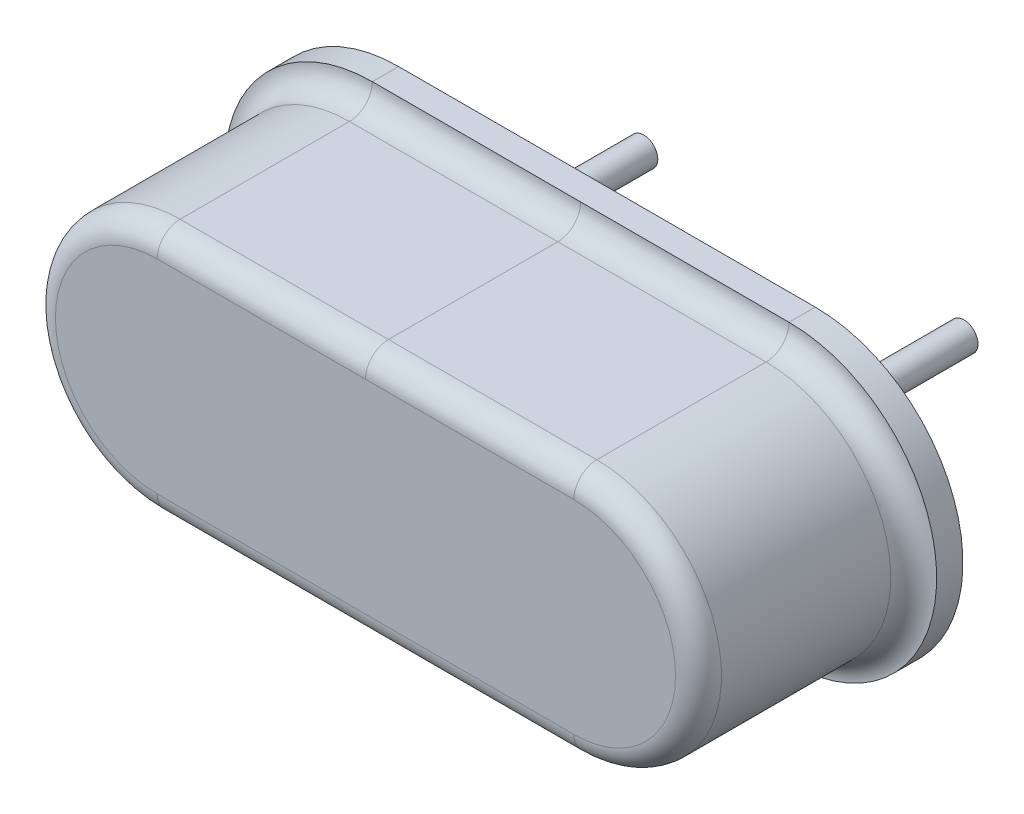
ISO-10303-21;
HEADER;
FILE_DESCRIPTION(('STEP AP214'),'2;1');
FILE_NAME('part.step','',(''),(''),'','','');
FILE_SCHEMA(('AUTOMOTIVE_DESIGN { 1 0 10303 214 1 1 1 1 }'));
ENDSEC;
DATA;
#1=APPLICATION_CONTEXT('core data for automotive mechanical design processes');
#2=APPLICATION_PROTOCOL_DEFINITION('international standard','automotive_design',2000,#1);
#3=PRODUCT_CONTEXT('',#1,'mechanical');
#4=PRODUCT('Part','Part','',(#3));
#5=PRODUCT_RELATED_PRODUCT_CATEGORY('part','',(#4));
#6=PRODUCT_DEFINITION_FORMATION('','',#4);
#7=PRODUCT_DEFINITION_CONTEXT('part definition',#1,'design');
#8=PRODUCT_DEFINITION('design','',#6,#7);
#9=PRODUCT_DEFINITION_SHAPE('','',#8);
#10=(LENGTH_UNIT() NAMED_UNIT(*) SI_UNIT(.MILLI.,.METRE.));
#11=(NAMED_UNIT(*) PLANE_ANGLE_UNIT() SI_UNIT($,.RADIAN.));
#12=(NAMED_UNIT(*) SI_UNIT($,.STERADIAN.) SOLID_ANGLE_UNIT());
#13=UNCERTAINTY_MEASURE_WITH_UNIT(LENGTH_MEASURE(1.E-05),#10,'distance_accuracy_value','');
#14=(GEOMETRIC_REPRESENTATION_CONTEXT(3) GLOBAL_UNCERTAINTY_ASSIGNED_CONTEXT((#13)) GLOBAL_UNIT_ASSIGNED_CONTEXT((#10,
#11,#12)) REPRESENTATION_CONTEXT('',''));
#15=CARTESIAN_POINT('',(0.,0.,0.));
#16=DIRECTION('',(0.,0.,1.));
#17=DIRECTION('',(1.,0.,0.));
#18=AXIS2_PLACEMENT_3D('',#15,#16,#17);
#19=CARTESIAN_POINT('',(-3.175,0.,3.68));
#20=DIRECTION('',(0.,0.,-1.));
#21=DIRECTION('',(-1.,0.,0.));
#22=AXIS2_PLACEMENT_3D('',#19,#20,#21);
#23=CYLINDRICAL_SURFACE('',#22,2.25);
#24=CARTESIAN_POINT('',(-3.175,0.,0.4));
#25=DIRECTION('',(0.,0.,1.));
#26=DIRECTION('',(0.,1.,0.));
#27=AXIS2_PLACEMENT_3D('',#24,#25,#26);
#28=CIRCLE('',#27,2.25);
#29=CARTESIAN_POINT('',(-3.175,2.25,0.4));
#30=VERTEX_POINT('',#29);
#31=CARTESIAN_POINT('',(-3.175,-2.25,0.4));
#32=VERTEX_POINT('',#31);
#33=EDGE_CURVE('E158',#30,#32,#28,.T.);
#34=ORIENTED_EDGE('',*,*,#33,.F.);
#35=DIRECTION('',(0.,0.,-1.));
#36=VECTOR('',#35,1.);
#37=CARTESIAN_POINT('',(-3.175,2.25,3.68));
#38=LINE('',#37,#36);
#39=CARTESIAN_POINT('',(-3.175,2.25,0.));
#40=VERTEX_POINT('',#39);
#41=EDGE_CURVE('E233',#30,#40,#38,.T.);
#42=ORIENTED_EDGE('',*,*,#41,.T.);
#43=CARTESIAN_POINT('',(-3.175,0.,0.));
#44=DIRECTION('',(0.,0.,1.));
#45=DIRECTION('',(1.,0.,0.));
#46=AXIS2_PLACEMENT_3D('',#43,#44,#45);
#47=CIRCLE('',#46,2.25);
#48=CARTESIAN_POINT('',(-3.175,-2.25,0.));
#49=VERTEX_POINT('',#48);
#50=EDGE_CURVE('E221',#40,#49,#47,.T.);
#51=ORIENTED_EDGE('',*,*,#50,.T.);
#52=DIRECTION('',(0.,0.,-1.));
#53=VECTOR('',#52,1.);
#54=CARTESIAN_POINT('',(-3.175,-2.25,3.68));
#55=LINE('',#54,#53);
#56=EDGE_CURVE('E239',#32,#49,#55,.T.);
#57=ORIENTED_EDGE('',*,*,#56,.F.);
#58=EDGE_LOOP('',(#34,#42,#51,#57));
#59=FACE_BOUND('',#58,.T.);
#60=ADVANCED_FACE('F33',(#59),#23,.T.);
#61=CARTESIAN_POINT('',(-3.175,-2.25,3.68));
#62=DIRECTION('',(0.,1.,0.));
#63=DIRECTION('',(0.,0.,1.));
#64=AXIS2_PLACEMENT_3D('',#61,#62,#63);
#65=PLANE('',#64);
#66=DIRECTION('',(1.,0.,0.));
#67=VECTOR('',#66,1.);
#68=CARTESIAN_POINT('',(-3.175,-2.25,0.4));
#69=LINE('',#68,#67);
#70=CARTESIAN_POINT('',(3.175,-2.25,0.4));
#71=VERTEX_POINT('',#70);
#72=EDGE_CURVE('E177',#32,#71,#69,.T.);
#73=ORIENTED_EDGE('',*,*,#72,.F.);
#74=ORIENTED_EDGE('',*,*,#56,.T.);
#75=DIRECTION('',(1.,0.,0.));
#76=VECTOR('',#75,1.);
#77=CARTESIAN_POINT('',(-3.175,-2.25,0.));
#78=LINE('',#77,#76);
#79=CARTESIAN_POINT('',(3.175,-2.25,0.));
#80=VERTEX_POINT('',#79);
#81=EDGE_CURVE('E224',#49,#80,#78,.T.);
#82=ORIENTED_EDGE('',*,*,#81,.T.);
#83=DIRECTION('',(0.,0.,-1.));
#84=VECTOR('',#83,1.);
#85=CARTESIAN_POINT('',(3.175,-2.25,3.68));
#86=LINE('',#85,#84);
#87=EDGE_CURVE('E237',#71,#80,#86,.T.);
#88=ORIENTED_EDGE('',*,*,#87,.F.);
#89=EDGE_LOOP('',(#73,#74,#82,#88));
#90=FACE_BOUND('',#89,.T.);
#91=ADVANCED_FACE('F269',(#90),#65,.F.);
#92=CARTESIAN_POINT('',(3.175,0.,3.68));
#93=DIRECTION('',(0.,0.,-1.));
#94=DIRECTION('',(-1.,0.,0.));
#95=AXIS2_PLACEMENT_3D('',#92,#93,#94);
#96=CYLINDRICAL_SURFACE('',#95,2.25);
#97=CARTESIAN_POINT('',(3.175,0.,0.4));
#98=DIRECTION('',(0.,0.,1.));
#99=DIRECTION('',(0.,-1.,0.));
#100=AXIS2_PLACEMENT_3D('',#97,#98,#99);
#101=CIRCLE('',#100,2.25);
#102=CARTESIAN_POINT('',(3.175,2.25,0.4));
#103=VERTEX_POINT('',#102);
#104=EDGE_CURVE('E165',#71,#103,#101,.T.);
#105=ORIENTED_EDGE('',*,*,#104,.F.);
#106=ORIENTED_EDGE('',*,*,#87,.T.);
#107=CARTESIAN_POINT('',(3.175,0.,0.));
#108=DIRECTION('',(0.,0.,1.));
#109=DIRECTION('',(1.,0.,0.));
#110=AXIS2_PLACEMENT_3D('',#107,#108,#109);
#111=CIRCLE('',#110,2.25);
#112=CARTESIAN_POINT('',(3.175,2.25,0.));
#113=VERTEX_POINT('',#112);
#114=EDGE_CURVE('E227',#80,#113,#111,.T.);
#115=ORIENTED_EDGE('',*,*,#114,.T.);
#116=DIRECTION('',(0.,0.,-1.));
#117=VECTOR('',#116,1.);
#118=CARTESIAN_POINT('',(3.175,2.25,3.68));
#119=LINE('',#118,#117);
#120=EDGE_CURVE('E235',#103,#113,#119,.T.);
#121=ORIENTED_EDGE('',*,*,#120,.F.);
#122=EDGE_LOOP('',(#105,#106,#115,#121));
#123=FACE_BOUND('',#122,.T.);
#124=ADVANCED_FACE('F265',(#123),#96,.T.);
#125=CARTESIAN_POINT('',(-3.175,2.25,3.68));
#126=DIRECTION('',(0.,-1.,0.));
#127=DIRECTION('',(0.,0.,-1.));
#128=AXIS2_PLACEMENT_3D('',#125,#126,#127);
#129=PLANE('',#128);
#130=DIRECTION('',(-1.,0.,0.));
#131=VECTOR('',#130,1.);
#132=CARTESIAN_POINT('',(0.,2.25,0.4));
#133=LINE('',#132,#131);
#134=CARTESIAN_POINT('',(0.,2.25,0.4));
#135=VERTEX_POINT('',#134);
#136=EDGE_CURVE('E136',#135,#30,#133,.T.);
#137=ORIENTED_EDGE('',*,*,#136,.F.);
#138=DIRECTION('',(-1.,0.,0.));
#139=VECTOR('',#138,1.);
#140=CARTESIAN_POINT('',(3.175,2.25,0.4));
#141=LINE('',#140,#139);
#142=EDGE_CURVE('E207',#103,#135,#141,.T.);
#143=ORIENTED_EDGE('',*,*,#142,.F.);
#144=ORIENTED_EDGE('',*,*,#120,.T.);
#145=DIRECTION('',(-1.,0.,0.));
#146=VECTOR('',#145,1.);
#147=CARTESIAN_POINT('',(-3.175,2.25,0.));
#148=LINE('',#147,#146);
#149=EDGE_CURVE('E230',#113,#40,#148,.T.);
#150=ORIENTED_EDGE('',*,*,#149,.T.);
#151=ORIENTED_EDGE('',*,*,#41,.F.);
#152=EDGE_LOOP('',(#137,#143,#144,#150,#151));
#153=FACE_BOUND('',#152,.T.);
#154=ADVANCED_FACE('F248',(#153),#129,.F.);
#155=CARTESIAN_POINT('',(-3.175,0.,0.));
#156=DIRECTION('',(0.,0.,1.));
#157=DIRECTION('',(1.,0.,0.));
#158=AXIS2_PLACEMENT_3D('',#155,#156,#157);
#159=PLANE('',#158);
#160=CARTESIAN_POINT('',(-2.44,0.,0.));
#161=DIRECTION('',(0.,0.,1.));
#162=DIRECTION('',(1.,0.,0.));
#163=AXIS2_PLACEMENT_3D('',#160,#161,#162);
#164=CIRCLE('',#163,0.215);
#165=CARTESIAN_POINT('',(-2.225,0.,0.));
#166=VERTEX_POINT('',#165);
#167=EDGE_CURVE('E11',#166,#166,#164,.F.);
#168=ORIENTED_EDGE('',*,*,#167,.F.);
#169=EDGE_LOOP('',(#168));
#170=FACE_BOUND('',#169,.T.);
#171=CARTESIAN_POINT('',(2.44,0.,0.));
#172=DIRECTION('',(0.,0.,1.));
#173=DIRECTION('',(1.,0.,0.));
#174=AXIS2_PLACEMENT_3D('',#171,#172,#173);
#175=CIRCLE('',#174,0.215);
#176=CARTESIAN_POINT('',(2.655,0.,0.));
#177=VERTEX_POINT('',#176);
#178=EDGE_CURVE('E40',#177,#177,#175,.F.);
#179=ORIENTED_EDGE('',*,*,#178,.F.);
#180=EDGE_LOOP('',(#179));
#181=FACE_BOUND('',#180,.T.);
#182=ORIENTED_EDGE('',*,*,#50,.F.);
#183=ORIENTED_EDGE('',*,*,#149,.F.);
#184=ORIENTED_EDGE('',*,*,#114,.F.);
#185=ORIENTED_EDGE('',*,*,#81,.F.);
#186=EDGE_LOOP('',(#182,#183,#184,#185));
#187=FACE_BOUND('',#186,.T.);
#188=ADVANCED_FACE('F245',(#170,#181,#187),#159,.F.);
#189=CARTESIAN_POINT('',(0.,1.55,3.33));
#190=DIRECTION('',(-1.,0.,0.));
#191=DIRECTION('',(0.,0.,1.));
#192=AXIS2_PLACEMENT_3D('',#189,#190,#191);
#193=CYLINDRICAL_SURFACE('',#192,0.35);
#194=DIRECTION('',(-1.,0.,0.));
#195=VECTOR('',#194,1.);
#196=CARTESIAN_POINT('',(0.,1.9,3.33));
#197=LINE('',#196,#195);
#198=CARTESIAN_POINT('',(0.,1.9,3.33));
#199=VERTEX_POINT('',#198);
#200=CARTESIAN_POINT('',(-3.175,1.9,3.33));
#201=VERTEX_POINT('',#200);
#202=EDGE_CURVE('E142',#199,#201,#197,.T.);
#203=ORIENTED_EDGE('',*,*,#202,.T.);
#204=CARTESIAN_POINT('',(-3.175,1.55,3.33));
#205=DIRECTION('',(-1.,0.,0.));
#206=DIRECTION('',(0.,0.,-1.));
#207=AXIS2_PLACEMENT_3D('',#204,#205,#206);
#208=CIRCLE('',#207,0.35);
#209=CARTESIAN_POINT('',(-3.175,1.55,3.68));
#210=VERTEX_POINT('',#209);
#211=EDGE_CURVE('E129',#210,#201,#208,.T.);
#212=ORIENTED_EDGE('',*,*,#211,.F.);
#213=DIRECTION('',(-1.,0.,0.));
#214=VECTOR('',#213,1.);
#215=CARTESIAN_POINT('',(0.,1.55,3.68));
#216=LINE('',#215,#214);
#217=CARTESIAN_POINT('',(0.,1.55,3.68));
#218=VERTEX_POINT('',#217);
#219=EDGE_CURVE('E140',#218,#210,#216,.T.);
#220=ORIENTED_EDGE('',*,*,#219,.F.);
#221=CARTESIAN_POINT('',(0.,1.55,3.33));
#222=DIRECTION('',(-1.,0.,0.));
#223=DIRECTION('',(0.,0.,-1.));
#224=AXIS2_PLACEMENT_3D('',#221,#222,#223);
#225=CIRCLE('',#224,0.35);
#226=EDGE_CURVE('E55',#218,#199,#225,.T.);
#227=ORIENTED_EDGE('',*,*,#226,.T.);
#228=EDGE_LOOP('',(#203,#212,#220,#227));
#229=FACE_BOUND('',#228,.T.);
#230=ADVANCED_FACE('F139',(#229),#193,.T.);
#231=CARTESIAN_POINT('',(0.,1.9,0.75));
#232=DIRECTION('',(0.,1.,0.));
#233=DIRECTION('',(0.,0.,1.));
#234=AXIS2_PLACEMENT_3D('',#231,#232,#233);
#235=PLANE('',#234);
#236=DIRECTION('',(-1.,0.,0.));
#237=VECTOR('',#236,1.);
#238=CARTESIAN_POINT('',(0.,1.9,0.75));
#239=LINE('',#238,#237);
#240=CARTESIAN_POINT('',(0.,1.9,0.75));
#241=VERTEX_POINT('',#240);
#242=CARTESIAN_POINT('',(-3.175,1.9,0.75));
#243=VERTEX_POINT('',#242);
#244=EDGE_CURVE('E191',#241,#243,#239,.T.);
#245=ORIENTED_EDGE('',*,*,#244,.T.);
#246=DIRECTION('',(0.,0.,-1.));
#247=VECTOR('',#246,1.);
#248=CARTESIAN_POINT('',(-3.175,1.9,0.75));
#249=LINE('',#248,#247);
#250=EDGE_CURVE('E168',#201,#243,#249,.T.);
#251=ORIENTED_EDGE('',*,*,#250,.F.);
#252=ORIENTED_EDGE('',*,*,#202,.F.);
#253=DIRECTION('',(0.,0.,-1.));
#254=VECTOR('',#253,1.);
#255=CARTESIAN_POINT('',(0.,1.9,0.75));
#256=LINE('',#255,#254);
#257=EDGE_CURVE('E149',#199,#241,#256,.T.);
#258=ORIENTED_EDGE('',*,*,#257,.T.);
#259=EDGE_LOOP('',(#245,#251,#252,#258));
#260=FACE_BOUND('',#259,.T.);
#261=ADVANCED_FACE('F338',(#260),#235,.T.);
#262=CARTESIAN_POINT('',(0.,2.25,0.75));
#263=DIRECTION('',(-1.,0.,0.));
#264=DIRECTION('',(0.,0.,1.));
#265=AXIS2_PLACEMENT_3D('',#262,#263,#264);
#266=CYLINDRICAL_SURFACE('',#265,0.35);
#267=ORIENTED_EDGE('',*,*,#136,.T.);
#268=CARTESIAN_POINT('',(-3.175,2.25,0.75));
#269=DIRECTION('',(1.,0.,0.));
#270=DIRECTION('',(0.,0.,1.));
#271=AXIS2_PLACEMENT_3D('',#268,#269,#270);
#272=CIRCLE('',#271,0.35);
#273=EDGE_CURVE('E193',#243,#30,#272,.T.);
#274=ORIENTED_EDGE('',*,*,#273,.F.);
#275=ORIENTED_EDGE('',*,*,#244,.F.);
#276=CARTESIAN_POINT('',(0.,2.25,0.75));
#277=DIRECTION('',(1.,0.,0.));
#278=DIRECTION('',(0.,0.,1.));
#279=AXIS2_PLACEMENT_3D('',#276,#277,#278);
#280=CIRCLE('',#279,0.35);
#281=EDGE_CURVE('E147',#241,#135,#280,.T.);
#282=ORIENTED_EDGE('',*,*,#281,.T.);
#283=EDGE_LOOP('',(#267,#274,#275,#282));
#284=FACE_BOUND('',#283,.T.);
#285=ADVANCED_FACE('F300',(#284),#266,.F.);
#286=CARTESIAN_POINT('',(-3.175,0.,3.33));
#287=DIRECTION('',(0.,0.,1.));
#288=DIRECTION('',(1.,0.,0.));
#289=AXIS2_PLACEMENT_3D('',#286,#287,#288);
#290=TOROIDAL_SURFACE('',#289,1.55,0.35);
#291=CARTESIAN_POINT('',(-3.175,0.,3.33));
#292=DIRECTION('',(0.,0.,1.));
#293=DIRECTION('',(0.,1.,0.));
#294=AXIS2_PLACEMENT_3D('',#291,#292,#293);
#295=CIRCLE('',#294,1.9);
#296=CARTESIAN_POINT('',(-3.175,-1.9,3.33));
#297=VERTEX_POINT('',#296);
#298=EDGE_CURVE('E170',#201,#297,#295,.T.);
#299=ORIENTED_EDGE('',*,*,#298,.T.);
#300=CARTESIAN_POINT('',(-3.175,-1.55,3.33));
#301=DIRECTION('',(1.,0.,0.));
#302=DIRECTION('',(0.,0.,-1.));
#303=AXIS2_PLACEMENT_3D('',#300,#301,#302);
#304=CIRCLE('',#303,0.35);
#305=CARTESIAN_POINT('',(-3.175,-1.55,3.68));
#306=VERTEX_POINT('',#305);
#307=EDGE_CURVE('E132',#306,#297,#304,.T.);
#308=ORIENTED_EDGE('',*,*,#307,.F.);
#309=CARTESIAN_POINT('',(-3.175,0.,3.68));
#310=DIRECTION('',(0.,0.,1.));
#311=DIRECTION('',(0.,1.,0.));
#312=AXIS2_PLACEMENT_3D('',#309,#310,#311);
#313=CIRCLE('',#312,1.55);
#314=EDGE_CURVE('E126',#210,#306,#313,.T.);
#315=ORIENTED_EDGE('',*,*,#314,.F.);
#316=ORIENTED_EDGE('',*,*,#211,.T.);
#317=EDGE_LOOP('',(#299,#308,#315,#316));
#318=FACE_BOUND('',#317,.T.);
#319=ADVANCED_FACE('F128',(#318),#290,.T.);
#320=CARTESIAN_POINT('',(-3.175,0.,0.));
#321=DIRECTION('',(0.,0.,1.));
#322=DIRECTION('',(1.,0.,0.));
#323=AXIS2_PLACEMENT_3D('',#320,#321,#322);
#324=CYLINDRICAL_SURFACE('',#323,1.9);
#325=CARTESIAN_POINT('',(-3.175,0.,0.75));
#326=DIRECTION('',(0.,0.,1.));
#327=DIRECTION('',(0.,1.,0.));
#328=AXIS2_PLACEMENT_3D('',#325,#326,#327);
#329=CIRCLE('',#328,1.9);
#330=CARTESIAN_POINT('',(-3.175,-1.9,0.75));
#331=VERTEX_POINT('',#330);
#332=EDGE_CURVE('E196',#243,#331,#329,.T.);
#333=ORIENTED_EDGE('',*,*,#332,.T.);
#334=DIRECTION('',(0.,0.,-1.));
#335=VECTOR('',#334,1.);
#336=CARTESIAN_POINT('',(-3.175,-1.9,0.75));
#337=LINE('',#336,#335);
#338=EDGE_CURVE('E172',#297,#331,#337,.T.);
#339=ORIENTED_EDGE('',*,*,#338,.F.);
#340=ORIENTED_EDGE('',*,*,#298,.F.);
#341=ORIENTED_EDGE('',*,*,#250,.T.);
#342=EDGE_LOOP('',(#333,#339,#340,#341));
#343=FACE_BOUND('',#342,.T.);
#344=ADVANCED_FACE('F358',(#343),#324,.T.);
#345=CARTESIAN_POINT('',(-3.175,0.,0.75));
#346=DIRECTION('',(0.,0.,1.));
#347=DIRECTION('',(1.,0.,0.));
#348=AXIS2_PLACEMENT_3D('',#345,#346,#347);
#349=TOROIDAL_SURFACE('',#348,2.25,0.35);
#350=ORIENTED_EDGE('',*,*,#33,.T.);
#351=CARTESIAN_POINT('',(-3.175,-2.25,0.75));
#352=DIRECTION('',(-1.,0.,0.));
#353=DIRECTION('',(0.,0.,1.));
#354=AXIS2_PLACEMENT_3D('',#351,#352,#353);
#355=CIRCLE('',#354,0.35);
#356=EDGE_CURVE('E198',#331,#32,#355,.T.);
#357=ORIENTED_EDGE('',*,*,#356,.F.);
#358=ORIENTED_EDGE('',*,*,#332,.F.);
#359=ORIENTED_EDGE('',*,*,#273,.T.);
#360=EDGE_LOOP('',(#350,#357,#358,#359));
#361=FACE_BOUND('',#360,.T.);
#362=ADVANCED_FACE('F297',(#361),#349,.F.);
#363=CARTESIAN_POINT('',(-3.175,-1.55,3.33));
#364=DIRECTION('',(1.,0.,0.));
#365=DIRECTION('',(0.,0.,-1.));
#366=AXIS2_PLACEMENT_3D('',#363,#364,#365);
#367=CYLINDRICAL_SURFACE('',#366,0.35);
#368=DIRECTION('',(1.,0.,0.));
#369=VECTOR('',#368,1.);
#370=CARTESIAN_POINT('',(-3.175,-1.9,3.33));
#371=LINE('',#370,#369);
#372=CARTESIAN_POINT('',(3.175,-1.9,3.33));
#373=VERTEX_POINT('',#372);
#374=EDGE_CURVE('E157',#297,#373,#371,.T.);
#375=ORIENTED_EDGE('',*,*,#374,.T.);
#376=CARTESIAN_POINT('',(3.175,-1.55,3.33));
#377=DIRECTION('',(1.,0.,0.));
#378=DIRECTION('',(0.,0.,-1.));
#379=AXIS2_PLACEMENT_3D('',#376,#377,#378);
#380=CIRCLE('',#379,0.35);
#381=CARTESIAN_POINT('',(3.175,-1.55,3.68));
#382=VERTEX_POINT('',#381);
#383=EDGE_CURVE('E173',#382,#373,#380,.T.);
#384=ORIENTED_EDGE('',*,*,#383,.F.);
#385=DIRECTION('',(1.,0.,0.));
#386=VECTOR('',#385,1.);
#387=CARTESIAN_POINT('',(-3.175,-1.55,3.68));
#388=LINE('',#387,#386);
#389=EDGE_CURVE('E155',#306,#382,#388,.T.);
#390=ORIENTED_EDGE('',*,*,#389,.F.);
#391=ORIENTED_EDGE('',*,*,#307,.T.);
#392=EDGE_LOOP('',(#375,#384,#390,#391));
#393=FACE_BOUND('',#392,.T.);
#394=ADVANCED_FACE('F372',(#393),#367,.T.);
#395=CARTESIAN_POINT('',(-3.175,-1.9,0.75));
#396=DIRECTION('',(0.,-1.,0.));
#397=DIRECTION('',(0.,0.,-1.));
#398=AXIS2_PLACEMENT_3D('',#395,#396,#397);
#399=PLANE('',#398);
#400=DIRECTION('',(1.,0.,0.));
#401=VECTOR('',#400,1.);
#402=CARTESIAN_POINT('',(-3.175,-1.9,0.75));
#403=LINE('',#402,#401);
#404=CARTESIAN_POINT('',(3.175,-1.9,0.75));
#405=VERTEX_POINT('',#404);
#406=EDGE_CURVE('E179',#331,#405,#403,.T.);
#407=ORIENTED_EDGE('',*,*,#406,.T.);
#408=DIRECTION('',(0.,0.,-1.));
#409=VECTOR('',#408,1.);
#410=CARTESIAN_POINT('',(3.175,-1.9,0.75));
#411=LINE('',#410,#409);
#412=EDGE_CURVE('E176',#373,#405,#411,.T.);
#413=ORIENTED_EDGE('',*,*,#412,.F.);
#414=ORIENTED_EDGE('',*,*,#374,.F.);
#415=ORIENTED_EDGE('',*,*,#338,.T.);
#416=EDGE_LOOP('',(#407,#413,#414,#415));
#417=FACE_BOUND('',#416,.T.);
#418=ADVANCED_FACE('F293',(#417),#399,.T.);
#419=CARTESIAN_POINT('',(-3.175,-2.25,0.75));
#420=DIRECTION('',(1.,0.,0.));
#421=DIRECTION('',(0.,0.,-1.));
#422=AXIS2_PLACEMENT_3D('',#419,#420,#421);
#423=CYLINDRICAL_SURFACE('',#422,0.35);
#424=ORIENTED_EDGE('',*,*,#72,.T.);
#425=CARTESIAN_POINT('',(3.175,-2.25,0.75));
#426=DIRECTION('',(-1.,0.,0.));
#427=DIRECTION('',(0.,0.,1.));
#428=AXIS2_PLACEMENT_3D('',#425,#426,#427);
#429=CIRCLE('',#428,0.35);
#430=EDGE_CURVE('E162',#405,#71,#429,.T.);
#431=ORIENTED_EDGE('',*,*,#430,.F.);
#432=ORIENTED_EDGE('',*,*,#406,.F.);
#433=ORIENTED_EDGE('',*,*,#356,.T.);
#434=EDGE_LOOP('',(#424,#431,#432,#433));
#435=FACE_BOUND('',#434,.T.);
#436=ADVANCED_FACE('F272',(#435),#423,.F.);
#437=CARTESIAN_POINT('',(3.175,0.,3.33));
#438=DIRECTION('',(0.,0.,1.));
#439=DIRECTION('',(1.,0.,0.));
#440=AXIS2_PLACEMENT_3D('',#437,#438,#439);
#441=TOROIDAL_SURFACE('',#440,1.55,0.35);
#442=CARTESIAN_POINT('',(3.175,0.,3.33));
#443=DIRECTION('',(0.,0.,1.));
#444=DIRECTION('',(0.,-1.,0.));
#445=AXIS2_PLACEMENT_3D('',#442,#443,#444);
#446=CIRCLE('',#445,1.9);
#447=CARTESIAN_POINT('',(3.175,1.9,3.33));
#448=VERTEX_POINT('',#447);
#449=EDGE_CURVE('E182',#373,#448,#446,.T.);
#450=ORIENTED_EDGE('',*,*,#449,.T.);
#451=CARTESIAN_POINT('',(3.175,1.55,3.33));
#452=DIRECTION('',(-1.,0.,0.));
#453=DIRECTION('',(0.,0.,-1.));
#454=AXIS2_PLACEMENT_3D('',#451,#452,#453);
#455=CIRCLE('',#454,0.35);
#456=CARTESIAN_POINT('',(3.175,1.55,3.68));
#457=VERTEX_POINT('',#456);
#458=EDGE_CURVE('E161',#457,#448,#455,.T.);
#459=ORIENTED_EDGE('',*,*,#458,.F.);
#460=CARTESIAN_POINT('',(3.175,0.,3.68));
#461=DIRECTION('',(0.,0.,1.));
#462=DIRECTION('',(0.,-1.,0.));
#463=AXIS2_PLACEMENT_3D('',#460,#461,#462);
#464=CIRCLE('',#463,1.55);
#465=EDGE_CURVE('E159',#382,#457,#464,.T.);
#466=ORIENTED_EDGE('',*,*,#465,.F.);
#467=ORIENTED_EDGE('',*,*,#383,.T.);
#468=EDGE_LOOP('',(#450,#459,#466,#467));
#469=FACE_BOUND('',#468,.T.);
#470=ADVANCED_FACE('F289',(#469),#441,.T.);
#471=CARTESIAN_POINT('',(3.175,0.,0.));
#472=DIRECTION('',(0.,0.,1.));
#473=DIRECTION('',(1.,0.,0.));
#474=AXIS2_PLACEMENT_3D('',#471,#472,#473);
#475=CYLINDRICAL_SURFACE('',#474,1.9);
#476=CARTESIAN_POINT('',(3.175,0.,0.75));
#477=DIRECTION('',(0.,0.,1.));
#478=DIRECTION('',(0.,-1.,0.));
#479=AXIS2_PLACEMENT_3D('',#476,#477,#478);
#480=CIRCLE('',#479,1.9);
#481=CARTESIAN_POINT('',(3.175,1.9,0.75));
#482=VERTEX_POINT('',#481);
#483=EDGE_CURVE('E204',#405,#482,#480,.T.);
#484=ORIENTED_EDGE('',*,*,#483,.T.);
#485=DIRECTION('',(0.,0.,-1.));
#486=VECTOR('',#485,1.);
#487=CARTESIAN_POINT('',(3.175,1.9,0.75));
#488=LINE('',#487,#486);
#489=EDGE_CURVE('E184',#448,#482,#488,.T.);
#490=ORIENTED_EDGE('',*,*,#489,.F.);
#491=ORIENTED_EDGE('',*,*,#449,.F.);
#492=ORIENTED_EDGE('',*,*,#412,.T.);
#493=EDGE_LOOP('',(#484,#490,#491,#492));
#494=FACE_BOUND('',#493,.T.);
#495=ADVANCED_FACE('F280',(#494),#475,.T.);
#496=CARTESIAN_POINT('',(3.175,0.,0.75));
#497=DIRECTION('',(0.,0.,1.));
#498=DIRECTION('',(1.,0.,0.));
#499=AXIS2_PLACEMENT_3D('',#496,#497,#498);
#500=TOROIDAL_SURFACE('',#499,2.25,0.35);
#501=ORIENTED_EDGE('',*,*,#104,.T.);
#502=CARTESIAN_POINT('',(3.175,2.25,0.75));
#503=DIRECTION('',(1.,0.,0.));
#504=DIRECTION('',(0.,0.,1.));
#505=AXIS2_PLACEMENT_3D('',#502,#503,#504);
#506=CIRCLE('',#505,0.35);
#507=EDGE_CURVE('E47',#482,#103,#506,.T.);
#508=ORIENTED_EDGE('',*,*,#507,.F.);
#509=ORIENTED_EDGE('',*,*,#483,.F.);
#510=ORIENTED_EDGE('',*,*,#430,.T.);
#511=EDGE_LOOP('',(#501,#508,#509,#510));
#512=FACE_BOUND('',#511,.T.);
#513=ADVANCED_FACE('F277',(#512),#500,.F.);
#514=CARTESIAN_POINT('',(3.175,1.55,3.33));
#515=DIRECTION('',(-1.,0.,0.));
#516=DIRECTION('',(0.,0.,1.));
#517=AXIS2_PLACEMENT_3D('',#514,#515,#516);
#518=CYLINDRICAL_SURFACE('',#517,0.35);
#519=DIRECTION('',(-1.,0.,0.));
#520=VECTOR('',#519,1.);
#521=CARTESIAN_POINT('',(3.175,1.55,3.68));
#522=LINE('',#521,#520);
#523=EDGE_CURVE('E146',#457,#218,#522,.T.);
#524=ORIENTED_EDGE('',*,*,#523,.F.);
#525=ORIENTED_EDGE('',*,*,#458,.T.);
#526=DIRECTION('',(-1.,0.,0.));
#527=VECTOR('',#526,1.);
#528=CARTESIAN_POINT('',(3.175,1.9,3.33));
#529=LINE('',#528,#527);
#530=EDGE_CURVE('E164',#448,#199,#529,.T.);
#531=ORIENTED_EDGE('',*,*,#530,.T.);
#532=ORIENTED_EDGE('',*,*,#226,.F.);
#533=EDGE_LOOP('',(#524,#525,#531,#532));
#534=FACE_BOUND('',#533,.T.);
#535=ADVANCED_FACE('F287',(#534),#518,.T.);
#536=CARTESIAN_POINT('',(3.175,1.9,0.75));
#537=DIRECTION('',(0.,1.,0.));
#538=DIRECTION('',(0.,0.,1.));
#539=AXIS2_PLACEMENT_3D('',#536,#537,#538);
#540=PLANE('',#539);
#541=ORIENTED_EDGE('',*,*,#530,.F.);
#542=ORIENTED_EDGE('',*,*,#489,.T.);
#543=DIRECTION('',(-1.,0.,0.));
#544=VECTOR('',#543,1.);
#545=CARTESIAN_POINT('',(3.175,1.9,0.75));
#546=LINE('',#545,#544);
#547=EDGE_CURVE('E186',#482,#241,#546,.T.);
#548=ORIENTED_EDGE('',*,*,#547,.T.);
#549=ORIENTED_EDGE('',*,*,#257,.F.);
#550=EDGE_LOOP('',(#541,#542,#548,#549));
#551=FACE_BOUND('',#550,.T.);
#552=ADVANCED_FACE('F285',(#551),#540,.T.);
#553=CARTESIAN_POINT('',(3.175,2.25,0.75));
#554=DIRECTION('',(-1.,0.,0.));
#555=DIRECTION('',(0.,0.,1.));
#556=AXIS2_PLACEMENT_3D('',#553,#554,#555);
#557=CYLINDRICAL_SURFACE('',#556,0.35);
#558=ORIENTED_EDGE('',*,*,#547,.F.);
#559=ORIENTED_EDGE('',*,*,#507,.T.);
#560=ORIENTED_EDGE('',*,*,#142,.T.);
#561=ORIENTED_EDGE('',*,*,#281,.F.);
#562=EDGE_LOOP('',(#558,#559,#560,#561));
#563=FACE_BOUND('',#562,.T.);
#564=ADVANCED_FACE('F302',(#563),#557,.F.);
#565=CARTESIAN_POINT('',(-3.175,0.,3.68));
#566=DIRECTION('',(0.,0.,1.));
#567=DIRECTION('',(1.,0.,0.));
#568=AXIS2_PLACEMENT_3D('',#565,#566,#567);
#569=PLANE('',#568);
#570=ORIENTED_EDGE('',*,*,#523,.T.);
#571=ORIENTED_EDGE('',*,*,#219,.T.);
#572=ORIENTED_EDGE('',*,*,#314,.T.);
#573=ORIENTED_EDGE('',*,*,#389,.T.);
#574=ORIENTED_EDGE('',*,*,#465,.T.);
#575=EDGE_LOOP('',(#570,#571,#572,#573,#574));
#576=FACE_BOUND('',#575,.T.);
#577=ADVANCED_FACE('F144',(#576),#569,.T.);
#578=CARTESIAN_POINT('',(2.44,0.,-3.));
#579=DIRECTION('',(0.,0.,1.));
#580=DIRECTION('',(1.,0.,0.));
#581=AXIS2_PLACEMENT_3D('',#578,#579,#580);
#582=CYLINDRICAL_SURFACE('',#581,0.215);
#583=CARTESIAN_POINT('',(2.44,0.,-3.));
#584=DIRECTION('',(0.,0.,-1.));
#585=DIRECTION('',(-1.,0.,0.));
#586=AXIS2_PLACEMENT_3D('',#583,#584,#585);
#587=CIRCLE('',#586,0.215);
#588=CARTESIAN_POINT('',(2.225,0.,-3.));
#589=VERTEX_POINT('',#588);
#590=EDGE_CURVE('E152',#589,#589,#587,.T.);
#591=ORIENTED_EDGE('',*,*,#590,.F.);
#592=EDGE_LOOP('',(#591));
#593=FACE_BOUND('',#592,.T.);
#594=ORIENTED_EDGE('',*,*,#178,.T.);
#595=EDGE_LOOP('',(#594));
#596=FACE_BOUND('',#595,.T.);
#597=ADVANCED_FACE('F243',(#593,#596),#582,.T.);
#598=CARTESIAN_POINT('',(2.44,0.,-3.));
#599=DIRECTION('',(0.,0.,-1.));
#600=DIRECTION('',(-1.,0.,0.));
#601=AXIS2_PLACEMENT_3D('',#598,#599,#600);
#602=PLANE('',#601);
#603=ORIENTED_EDGE('',*,*,#590,.T.);
#604=EDGE_LOOP('',(#603));
#605=FACE_BOUND('',#604,.T.);
#606=ADVANCED_FACE('F436',(#605),#602,.T.);
#607=CARTESIAN_POINT('',(-2.44,0.,-3.));
#608=DIRECTION('',(0.,0.,1.));
#609=DIRECTION('',(1.,0.,0.));
#610=AXIS2_PLACEMENT_3D('',#607,#608,#609);
#611=CYLINDRICAL_SURFACE('',#610,0.215);
#612=CARTESIAN_POINT('',(-2.44,0.,-3.));
#613=DIRECTION('',(0.,0.,-1.));
#614=DIRECTION('',(-1.,0.,0.));
#615=AXIS2_PLACEMENT_3D('',#612,#613,#614);
#616=CIRCLE('',#615,0.215);
#617=CARTESIAN_POINT('',(-2.655,0.,-3.));
#618=VERTEX_POINT('',#617);
#619=EDGE_CURVE('E472',#618,#618,#616,.T.);
#620=ORIENTED_EDGE('',*,*,#619,.F.);
#621=EDGE_LOOP('',(#620));
#622=FACE_BOUND('',#621,.T.);
#623=ORIENTED_EDGE('',*,*,#167,.T.);
#624=EDGE_LOOP('',(#623));
#625=FACE_BOUND('',#624,.T.);
#626=ADVANCED_FACE('F443',(#622,#625),#611,.T.);
#627=CARTESIAN_POINT('',(-2.44,0.,-3.));
#628=DIRECTION('',(0.,0.,-1.));
#629=DIRECTION('',(-1.,0.,0.));
#630=AXIS2_PLACEMENT_3D('',#627,#628,#629);
#631=PLANE('',#630);
#632=ORIENTED_EDGE('',*,*,#619,.T.);
#633=EDGE_LOOP('',(#632));
#634=FACE_BOUND('',#633,.T.);
#635=ADVANCED_FACE('F451',(#634),#631,.T.);
#636=CLOSED_SHELL('',(#60,#91,#124,#154,#188,#230,#261,#285,#319,#344,#362,#394,#418,#436,#470,
#495,#513,#535,#552,#564,#577,#597,#606,#626,#635));
#637=MANIFOLD_SOLID_BREP('B2',#636);
#638=ADVANCED_BREP_SHAPE_REPRESENTATION('',(#18,#637),#14);
#639=SHAPE_DEFINITION_REPRESENTATION(#9,#638);
ENDSEC;
END-ISO-10303-21;
